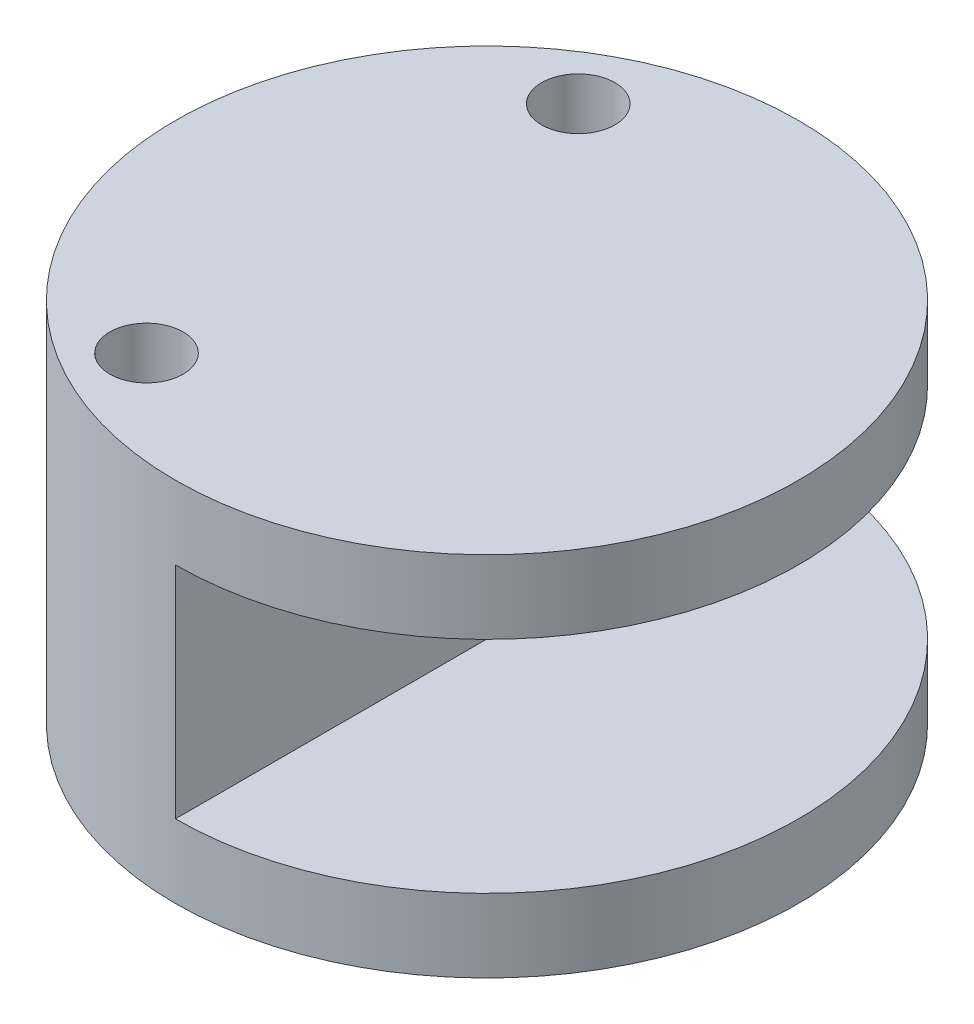
ISO-10303-21;
HEADER;
FILE_DESCRIPTION(('STEP AP214'),'2;1');
FILE_NAME('part.step','',(''),(''),'','','');
FILE_SCHEMA(('AUTOMOTIVE_DESIGN { 1 0 10303 214 1 1 1 1 }'));
ENDSEC;
DATA;
#1=APPLICATION_CONTEXT('core data for automotive mechanical design processes');
#2=APPLICATION_PROTOCOL_DEFINITION('international standard','automotive_design',2000,#1);
#3=PRODUCT_CONTEXT('',#1,'mechanical');
#4=PRODUCT('Part','Part','',(#3));
#5=PRODUCT_RELATED_PRODUCT_CATEGORY('part','',(#4));
#6=PRODUCT_DEFINITION_FORMATION('','',#4);
#7=PRODUCT_DEFINITION_CONTEXT('part definition',#1,'design');
#8=PRODUCT_DEFINITION('design','',#6,#7);
#9=PRODUCT_DEFINITION_SHAPE('','',#8);
#10=(LENGTH_UNIT() NAMED_UNIT(*) SI_UNIT(.MILLI.,.METRE.));
#11=(NAMED_UNIT(*) PLANE_ANGLE_UNIT() SI_UNIT($,.RADIAN.));
#12=(NAMED_UNIT(*) SI_UNIT($,.STERADIAN.) SOLID_ANGLE_UNIT());
#13=UNCERTAINTY_MEASURE_WITH_UNIT(LENGTH_MEASURE(1.E-05),#10,'distance_accuracy_value','');
#14=(GEOMETRIC_REPRESENTATION_CONTEXT(3) GLOBAL_UNCERTAINTY_ASSIGNED_CONTEXT((#13)) GLOBAL_UNIT_ASSIGNED_CONTEXT((#10,
#11,#12)) REPRESENTATION_CONTEXT('',''));
#15=CARTESIAN_POINT('',(0.,0.,0.));
#16=DIRECTION('',(0.,0.,1.));
#17=DIRECTION('',(1.,0.,0.));
#18=AXIS2_PLACEMENT_3D('',#15,#16,#17);
#19=CARTESIAN_POINT('',(0.,-12.7,0.));
#20=DIRECTION('',(0.,1.,0.));
#21=DIRECTION('',(0.,0.,1.));
#22=AXIS2_PLACEMENT_3D('',#19,#20,#21);
#23=CYLINDRICAL_SURFACE('',#22,10.795);
#24=DIRECTION('',(0.,1.,0.));
#25=VECTOR('',#24,1.);
#26=CARTESIAN_POINT('',(0.,-12.7,10.795));
#27=LINE('',#26,#25);
#28=CARTESIAN_POINT('',(0.,-2.54,10.795));
#29=VERTEX_POINT('',#28);
#30=CARTESIAN_POINT('',(0.,-10.16,10.795));
#31=VERTEX_POINT('',#30);
#32=EDGE_CURVE('E11',#29,#31,#27,.F.);
#33=ORIENTED_EDGE('',*,*,#32,.F.);
#34=CARTESIAN_POINT('',(0.,-2.54,0.));
#35=DIRECTION('',(0.,1.,0.));
#36=DIRECTION('',(0.,0.,1.));
#37=AXIS2_PLACEMENT_3D('',#34,#35,#36);
#38=CIRCLE('',#37,10.795);
#39=CARTESIAN_POINT('',(0.,-2.54,-10.795));
#40=VERTEX_POINT('',#39);
#41=EDGE_CURVE('E41',#40,#29,#38,.F.);
#42=ORIENTED_EDGE('',*,*,#41,.F.);
#43=DIRECTION('',(0.,1.,0.));
#44=VECTOR('',#43,1.);
#45=CARTESIAN_POINT('',(0.,-12.7,-10.795));
#46=LINE('',#45,#44);
#47=CARTESIAN_POINT('',(0.,-10.16,-10.795));
#48=VERTEX_POINT('',#47);
#49=EDGE_CURVE('E66',#48,#40,#46,.T.);
#50=ORIENTED_EDGE('',*,*,#49,.F.);
#51=CARTESIAN_POINT('',(0.,-10.16,0.));
#52=DIRECTION('',(0.,1.,0.));
#53=DIRECTION('',(0.,0.,1.));
#54=AXIS2_PLACEMENT_3D('',#51,#52,#53);
#55=CIRCLE('',#54,10.795);
#56=EDGE_CURVE('E54',#48,#31,#55,.F.);
#57=ORIENTED_EDGE('',*,*,#56,.T.);
#58=EDGE_LOOP('',(#33,#42,#50,#57));
#59=FACE_BOUND('',#58,.T.);
#60=CARTESIAN_POINT('',(0.,-12.7,0.));
#61=DIRECTION('',(0.,1.,0.));
#62=DIRECTION('',(0.,0.,1.));
#63=AXIS2_PLACEMENT_3D('',#60,#61,#62);
#64=CIRCLE('',#63,10.795);
#65=CARTESIAN_POINT('',(0.,-12.7,10.795));
#66=VERTEX_POINT('',#65);
#67=EDGE_CURVE('E75',#66,#66,#64,.T.);
#68=ORIENTED_EDGE('',*,*,#67,.T.);
#69=EDGE_LOOP('',(#68));
#70=FACE_BOUND('',#69,.T.);
#71=CARTESIAN_POINT('',(0.,0.,0.));
#72=DIRECTION('',(0.,1.,0.));
#73=DIRECTION('',(0.,0.,1.));
#74=AXIS2_PLACEMENT_3D('',#71,#72,#73);
#75=CIRCLE('',#74,10.795);
#76=CARTESIAN_POINT('',(0.,0.,10.795));
#77=VERTEX_POINT('',#76);
#78=EDGE_CURVE('E78',#77,#77,#75,.T.);
#79=ORIENTED_EDGE('',*,*,#78,.F.);
#80=EDGE_LOOP('',(#79));
#81=FACE_BOUND('',#80,.T.);
#82=ADVANCED_FACE('F34',(#59,#70,#81),#23,.T.);
#83=CARTESIAN_POINT('',(0.,-12.7,0.));
#84=DIRECTION('',(0.,1.,0.));
#85=DIRECTION('',(0.,0.,1.));
#86=AXIS2_PLACEMENT_3D('',#83,#84,#85);
#87=PLANE('',#86);
#88=ORIENTED_EDGE('',*,*,#67,.F.);
#89=EDGE_LOOP('',(#88));
#90=FACE_BOUND('',#89,.T.);
#91=ADVANCED_FACE('F71',(#90),#87,.F.);
#92=CARTESIAN_POINT('',(0.,0.,0.));
#93=DIRECTION('',(0.,1.,0.));
#94=DIRECTION('',(0.,0.,1.));
#95=AXIS2_PLACEMENT_3D('',#92,#93,#94);
#96=PLANE('',#95);
#97=CARTESIAN_POINT('',(-4.31799999999993,0.,-7.47899538708245));
#98=DIRECTION('',(0.,1.,0.));
#99=DIRECTION('',(0.,0.,1.));
#100=AXIS2_PLACEMENT_3D('',#97,#98,#99);
#101=CIRCLE('',#100,1.27);
#102=CARTESIAN_POINT('',(-4.31799999999993,0.,-6.20899538708245));
#103=VERTEX_POINT('',#102);
#104=EDGE_CURVE('E89',#103,#103,#101,.T.);
#105=ORIENTED_EDGE('',*,*,#104,.F.);
#106=EDGE_LOOP('',(#105));
#107=FACE_BOUND('',#106,.T.);
#108=CARTESIAN_POINT('',(-4.31800000000004,0.,7.47899538708239));
#109=DIRECTION('',(0.,1.,0.));
#110=DIRECTION('',(0.,0.,1.));
#111=AXIS2_PLACEMENT_3D('',#108,#109,#110);
#112=CIRCLE('',#111,1.27);
#113=CARTESIAN_POINT('',(-4.31800000000004,0.,8.7489953870824));
#114=VERTEX_POINT('',#113);
#115=EDGE_CURVE('E86',#114,#114,#112,.T.);
#116=ORIENTED_EDGE('',*,*,#115,.F.);
#117=EDGE_LOOP('',(#116));
#118=FACE_BOUND('',#117,.T.);
#119=ORIENTED_EDGE('',*,*,#78,.T.);
#120=EDGE_LOOP('',(#119));
#121=FACE_BOUND('',#120,.T.);
#122=ADVANCED_FACE('F100',(#107,#118,#121),#96,.T.);
#123=CARTESIAN_POINT('',(10.795,-2.54,13.6480910790271));
#124=DIRECTION('',(0.,1.,0.));
#125=DIRECTION('',(0.,0.,1.));
#126=AXIS2_PLACEMENT_3D('',#123,#124,#125);
#127=PLANE('',#126);
#128=ORIENTED_EDGE('',*,*,#41,.T.);
#129=DIRECTION('',(0.,0.,-1.));
#130=VECTOR('',#129,1.);
#131=CARTESIAN_POINT('',(0.,-2.54,13.6480910790271));
#132=LINE('',#131,#130);
#133=EDGE_CURVE('E64',#29,#40,#132,.T.);
#134=ORIENTED_EDGE('',*,*,#133,.T.);
#135=EDGE_LOOP('',(#128,#134));
#136=FACE_BOUND('',#135,.T.);
#137=ADVANCED_FACE('F63',(#136),#127,.F.);
#138=CARTESIAN_POINT('',(10.795,-10.16,13.6480910790271));
#139=DIRECTION('',(0.,1.,0.));
#140=DIRECTION('',(0.,0.,1.));
#141=AXIS2_PLACEMENT_3D('',#138,#139,#140);
#142=PLANE('',#141);
#143=DIRECTION('',(0.,0.,-1.));
#144=VECTOR('',#143,1.);
#145=CARTESIAN_POINT('',(0.,-10.16,13.6480910790271));
#146=LINE('',#145,#144);
#147=EDGE_CURVE('E47',#31,#48,#146,.T.);
#148=ORIENTED_EDGE('',*,*,#147,.F.);
#149=ORIENTED_EDGE('',*,*,#56,.F.);
#150=EDGE_LOOP('',(#148,#149));
#151=FACE_BOUND('',#150,.T.);
#152=ADVANCED_FACE('F116',(#151),#142,.T.);
#153=CARTESIAN_POINT('',(0.,0.,0.));
#154=DIRECTION('',(-1.,0.,0.));
#155=DIRECTION('',(0.,0.,1.));
#156=AXIS2_PLACEMENT_3D('',#153,#154,#155);
#157=PLANE('',#156);
#158=ORIENTED_EDGE('',*,*,#32,.T.);
#159=ORIENTED_EDGE('',*,*,#147,.T.);
#160=ORIENTED_EDGE('',*,*,#49,.T.);
#161=ORIENTED_EDGE('',*,*,#133,.F.);
#162=EDGE_LOOP('',(#158,#159,#160,#161));
#163=FACE_BOUND('',#162,.T.);
#164=ADVANCED_FACE('F65',(#163),#157,.F.);
#165=CARTESIAN_POINT('',(-4.31800000000004,-7.62,7.47899538708239));
#166=DIRECTION('',(0.,1.,0.));
#167=DIRECTION('',(0.,0.,1.));
#168=AXIS2_PLACEMENT_3D('',#165,#166,#167);
#169=CYLINDRICAL_SURFACE('',#168,1.27);
#170=CARTESIAN_POINT('',(-4.31800000000004,-7.62,7.47899538708239));
#171=DIRECTION('',(0.,1.,0.));
#172=DIRECTION('',(0.,0.,1.));
#173=AXIS2_PLACEMENT_3D('',#170,#171,#172);
#174=CIRCLE('',#173,1.27);
#175=CARTESIAN_POINT('',(-4.31800000000004,-7.62,8.7489953870824));
#176=VERTEX_POINT('',#175);
#177=EDGE_CURVE('E67',#176,#176,#174,.T.);
#178=CARTESIAN_POINT('',(-4.31800000000004,-7.62,8.7489953870824));
#179=CARTESIAN_POINT('',(-4.31800000000004,-7.540625,8.7489953870824));
#180=CARTESIAN_POINT('',(-4.31800000000004,-7.46125,8.7489953870824));
#181=CARTESIAN_POINT('',(-4.31800000000004,-7.3025,8.7489953870824));
#182=CARTESIAN_POINT('',(-4.31800000000004,-7.223125,8.7489953870824));
#183=CARTESIAN_POINT('',(-4.31800000000004,-7.064375,8.7489953870824));
#184=CARTESIAN_POINT('',(-4.31800000000004,-6.985,8.7489953870824));
#185=CARTESIAN_POINT('',(-4.31800000000004,-6.82625,8.7489953870824));
#186=CARTESIAN_POINT('',(-4.31800000000004,-6.746875,8.7489953870824));
#187=CARTESIAN_POINT('',(-4.31800000000004,-6.588125,8.7489953870824));
#188=CARTESIAN_POINT('',(-4.31800000000004,-6.50875,8.7489953870824));
#189=CARTESIAN_POINT('',(-4.31800000000004,-6.35,8.7489953870824));
#190=CARTESIAN_POINT('',(-4.31800000000004,-6.270625,8.7489953870824));
#191=CARTESIAN_POINT('',(-4.31800000000004,-6.111875,8.7489953870824));
#192=CARTESIAN_POINT('',(-4.31800000000004,-6.0325,8.7489953870824));
#193=CARTESIAN_POINT('',(-4.31800000000004,-5.87375,8.7489953870824));
#194=CARTESIAN_POINT('',(-4.31800000000004,-5.794375,8.7489953870824));
#195=CARTESIAN_POINT('',(-4.31800000000004,-5.635625,8.7489953870824));
#196=CARTESIAN_POINT('',(-4.31800000000004,-5.55625,8.7489953870824));
#197=CARTESIAN_POINT('',(-4.31800000000004,-5.3975,8.7489953870824));
#198=CARTESIAN_POINT('',(-4.31800000000004,-5.318125,8.7489953870824));
#199=CARTESIAN_POINT('',(-4.31800000000004,-5.159375,8.7489953870824));
#200=CARTESIAN_POINT('',(-4.31800000000004,-5.08,8.7489953870824));
#201=CARTESIAN_POINT('',(-4.31800000000004,-4.92125,8.7489953870824));
#202=CARTESIAN_POINT('',(-4.31800000000004,-4.841875,8.7489953870824));
#203=CARTESIAN_POINT('',(-4.31800000000004,-4.683125,8.7489953870824));
#204=CARTESIAN_POINT('',(-4.31800000000004,-4.60375,8.7489953870824));
#205=CARTESIAN_POINT('',(-4.31800000000004,-4.445,8.7489953870824));
#206=CARTESIAN_POINT('',(-4.31800000000004,-4.365625,8.7489953870824));
#207=CARTESIAN_POINT('',(-4.31800000000004,-4.206875,8.7489953870824));
#208=CARTESIAN_POINT('',(-4.31800000000004,-4.1275,8.7489953870824));
#209=CARTESIAN_POINT('',(-4.31800000000004,-3.96875,8.7489953870824));
#210=CARTESIAN_POINT('',(-4.31800000000004,-3.889375,8.7489953870824));
#211=CARTESIAN_POINT('',(-4.31800000000004,-3.730625,8.7489953870824));
#212=CARTESIAN_POINT('',(-4.31800000000004,-3.65125,8.7489953870824));
#213=CARTESIAN_POINT('',(-4.31800000000004,-3.4925,8.7489953870824));
#214=CARTESIAN_POINT('',(-4.31800000000004,-3.413125,8.7489953870824));
#215=CARTESIAN_POINT('',(-4.31800000000004,-3.254375,8.7489953870824));
#216=CARTESIAN_POINT('',(-4.31800000000004,-3.175,8.7489953870824));
#217=CARTESIAN_POINT('',(-4.31800000000004,-3.01625,8.7489953870824));
#218=CARTESIAN_POINT('',(-4.31800000000004,-2.936875,8.7489953870824));
#219=CARTESIAN_POINT('',(-4.31800000000004,-2.778125,8.7489953870824));
#220=CARTESIAN_POINT('',(-4.31800000000004,-2.69875,8.7489953870824));
#221=CARTESIAN_POINT('',(-4.31800000000004,-2.54,8.7489953870824));
#222=CARTESIAN_POINT('',(-4.31800000000004,-2.460625,8.7489953870824));
#223=CARTESIAN_POINT('',(-4.31800000000004,-2.301875,8.7489953870824));
#224=CARTESIAN_POINT('',(-4.31800000000004,-2.2225,8.7489953870824));
#225=CARTESIAN_POINT('',(-4.31800000000004,-2.06375,8.7489953870824));
#226=CARTESIAN_POINT('',(-4.31800000000004,-1.984375,8.7489953870824));
#227=CARTESIAN_POINT('',(-4.31800000000004,-1.825625,8.7489953870824));
#228=CARTESIAN_POINT('',(-4.31800000000004,-1.74625,8.7489953870824));
#229=CARTESIAN_POINT('',(-4.31800000000004,-1.5875,8.7489953870824));
#230=CARTESIAN_POINT('',(-4.31800000000004,-1.508125,8.7489953870824));
#231=CARTESIAN_POINT('',(-4.31800000000004,-1.349375,8.7489953870824));
#232=CARTESIAN_POINT('',(-4.31800000000004,-1.27,8.7489953870824));
#233=CARTESIAN_POINT('',(-4.31800000000004,-1.11125,8.7489953870824));
#234=CARTESIAN_POINT('',(-4.31800000000004,-1.031875,8.7489953870824));
#235=CARTESIAN_POINT('',(-4.31800000000004,-0.873125,8.7489953870824));
#236=CARTESIAN_POINT('',(-4.31800000000004,-0.79375,8.7489953870824));
#237=CARTESIAN_POINT('',(-4.31800000000004,-0.635,8.7489953870824));
#238=CARTESIAN_POINT('',(-4.31800000000004,-0.555625,8.7489953870824));
#239=CARTESIAN_POINT('',(-4.31800000000004,-0.396875,8.7489953870824));
#240=CARTESIAN_POINT('',(-4.31800000000004,-0.3175,8.7489953870824));
#241=CARTESIAN_POINT('',(-4.31800000000004,-0.15875,8.7489953870824));
#242=CARTESIAN_POINT('',(-4.31800000000004,-0.0793749999999999,8.7489953870824));
#243=CARTESIAN_POINT('',(-4.31800000000004,0.,8.7489953870824));
#244=B_SPLINE_CURVE_WITH_KNOTS('',3,(#178,#179,#180,#181,#182,#183,#184,#185,#186,#187,#188,
#189,#190,#191,#192,#193,#194,#195,#196,#197,#198,#199,#200,#201,#202,#203,#204,#205,#206,#207,
#208,#209,#210,#211,#212,#213,#214,#215,#216,#217,#218,#219,#220,#221,#222,#223,#224,#225,#226,
#227,#228,#229,#230,#231,#232,#233,#234,#235,#236,#237,#238,#239,#240,#241,#242,#243),
.UNSPECIFIED.,.F.,.F.,(4,2,2,2,2,2,2,2,2,2,2,2,2,2,2,2,2,2,2,2,2,2,2,2,2,2,2,2,2,2,2,2,4),(0.,
0.238125,0.47625,0.714375000000001,0.9525,1.190625,1.42875,1.666875,1.905,2.143125,2.38125,
2.619375,2.8575,3.095625,3.33375,3.571875,3.81,4.048125,4.28625,4.524375,4.7625,5.000625,
5.23875,5.476875,5.715,5.953125,6.19125,6.429375,6.6675,6.905625,7.14375,7.381875,7.62),.UNSPECIFIED.);
#245=EDGE_CURVE('BSEAM105',#176,#114,#244,.T.);
#246=ORIENTED_EDGE('',*,*,#177,.F.);
#247=ORIENTED_EDGE('',*,*,#115,.T.);
#248=ORIENTED_EDGE('',*,*,#245,.T.);
#249=ORIENTED_EDGE('',*,*,#245,.F.);
#250=EDGE_LOOP('',(#246,#248,#247,#249));
#251=FACE_BOUND('',#250,.T.);
#252=ADVANCED_FACE('F105',(#251),#169,.F.);
#253=CARTESIAN_POINT('',(-4.31800000000004,-7.62,7.47899538708239));
#254=DIRECTION('',(0.,1.,0.));
#255=DIRECTION('',(0.,0.,1.));
#256=AXIS2_PLACEMENT_3D('',#253,#254,#255);
#257=PLANE('',#256);
#258=ORIENTED_EDGE('',*,*,#177,.T.);
#259=EDGE_LOOP('',(#258));
#260=FACE_BOUND('',#259,.T.);
#261=ADVANCED_FACE('F107',(#260),#257,.T.);
#262=CARTESIAN_POINT('',(-4.31799999999993,-7.62,-7.47899538708245));
#263=DIRECTION('',(0.,1.,0.));
#264=DIRECTION('',(0.,0.,1.));
#265=AXIS2_PLACEMENT_3D('',#262,#263,#264);
#266=CYLINDRICAL_SURFACE('',#265,1.27);
#267=CARTESIAN_POINT('',(-4.31799999999993,-7.62,-7.47899538708245));
#268=DIRECTION('',(0.,1.,0.));
#269=DIRECTION('',(0.,0.,1.));
#270=AXIS2_PLACEMENT_3D('',#267,#268,#269);
#271=CIRCLE('',#270,1.27);
#272=CARTESIAN_POINT('',(-4.31799999999993,-7.62,-6.20899538708245));
#273=VERTEX_POINT('',#272);
#274=EDGE_CURVE('E92',#273,#273,#271,.T.);
#275=CARTESIAN_POINT('',(-4.31799999999993,-7.62,-6.20899538708245));
#276=CARTESIAN_POINT('',(-4.31799999999993,-7.540625,-6.20899538708245));
#277=CARTESIAN_POINT('',(-4.31799999999993,-7.46125,-6.20899538708245));
#278=CARTESIAN_POINT('',(-4.31799999999993,-7.3025,-6.20899538708245));
#279=CARTESIAN_POINT('',(-4.31799999999993,-7.223125,-6.20899538708245));
#280=CARTESIAN_POINT('',(-4.31799999999993,-7.064375,-6.20899538708245));
#281=CARTESIAN_POINT('',(-4.31799999999993,-6.985,-6.20899538708245));
#282=CARTESIAN_POINT('',(-4.31799999999993,-6.82625,-6.20899538708245));
#283=CARTESIAN_POINT('',(-4.31799999999993,-6.746875,-6.20899538708245));
#284=CARTESIAN_POINT('',(-4.31799999999993,-6.588125,-6.20899538708245));
#285=CARTESIAN_POINT('',(-4.31799999999993,-6.50875,-6.20899538708245));
#286=CARTESIAN_POINT('',(-4.31799999999993,-6.35,-6.20899538708245));
#287=CARTESIAN_POINT('',(-4.31799999999993,-6.270625,-6.20899538708245));
#288=CARTESIAN_POINT('',(-4.31799999999993,-6.111875,-6.20899538708245));
#289=CARTESIAN_POINT('',(-4.31799999999993,-6.0325,-6.20899538708245));
#290=CARTESIAN_POINT('',(-4.31799999999993,-5.87375,-6.20899538708245));
#291=CARTESIAN_POINT('',(-4.31799999999993,-5.794375,-6.20899538708245));
#292=CARTESIAN_POINT('',(-4.31799999999993,-5.635625,-6.20899538708245));
#293=CARTESIAN_POINT('',(-4.31799999999993,-5.55625,-6.20899538708245));
#294=CARTESIAN_POINT('',(-4.31799999999993,-5.3975,-6.20899538708245));
#295=CARTESIAN_POINT('',(-4.31799999999993,-5.318125,-6.20899538708245));
#296=CARTESIAN_POINT('',(-4.31799999999993,-5.159375,-6.20899538708245));
#297=CARTESIAN_POINT('',(-4.31799999999993,-5.08,-6.20899538708245));
#298=CARTESIAN_POINT('',(-4.31799999999993,-4.92125,-6.20899538708245));
#299=CARTESIAN_POINT('',(-4.31799999999993,-4.841875,-6.20899538708245));
#300=CARTESIAN_POINT('',(-4.31799999999993,-4.683125,-6.20899538708245));
#301=CARTESIAN_POINT('',(-4.31799999999993,-4.60375,-6.20899538708245));
#302=CARTESIAN_POINT('',(-4.31799999999993,-4.445,-6.20899538708245));
#303=CARTESIAN_POINT('',(-4.31799999999993,-4.365625,-6.20899538708245));
#304=CARTESIAN_POINT('',(-4.31799999999993,-4.206875,-6.20899538708245));
#305=CARTESIAN_POINT('',(-4.31799999999993,-4.1275,-6.20899538708245));
#306=CARTESIAN_POINT('',(-4.31799999999993,-3.96875,-6.20899538708245));
#307=CARTESIAN_POINT('',(-4.31799999999993,-3.889375,-6.20899538708245));
#308=CARTESIAN_POINT('',(-4.31799999999993,-3.730625,-6.20899538708245));
#309=CARTESIAN_POINT('',(-4.31799999999993,-3.65125,-6.20899538708245));
#310=CARTESIAN_POINT('',(-4.31799999999993,-3.4925,-6.20899538708245));
#311=CARTESIAN_POINT('',(-4.31799999999993,-3.413125,-6.20899538708245));
#312=CARTESIAN_POINT('',(-4.31799999999993,-3.254375,-6.20899538708245));
#313=CARTESIAN_POINT('',(-4.31799999999993,-3.175,-6.20899538708245));
#314=CARTESIAN_POINT('',(-4.31799999999993,-3.01625,-6.20899538708245));
#315=CARTESIAN_POINT('',(-4.31799999999993,-2.936875,-6.20899538708245));
#316=CARTESIAN_POINT('',(-4.31799999999993,-2.778125,-6.20899538708245));
#317=CARTESIAN_POINT('',(-4.31799999999993,-2.69875,-6.20899538708245));
#318=CARTESIAN_POINT('',(-4.31799999999993,-2.54,-6.20899538708245));
#319=CARTESIAN_POINT('',(-4.31799999999993,-2.460625,-6.20899538708245));
#320=CARTESIAN_POINT('',(-4.31799999999993,-2.301875,-6.20899538708245));
#321=CARTESIAN_POINT('',(-4.31799999999993,-2.2225,-6.20899538708245));
#322=CARTESIAN_POINT('',(-4.31799999999993,-2.06375,-6.20899538708245));
#323=CARTESIAN_POINT('',(-4.31799999999993,-1.984375,-6.20899538708245));
#324=CARTESIAN_POINT('',(-4.31799999999993,-1.825625,-6.20899538708245));
#325=CARTESIAN_POINT('',(-4.31799999999993,-1.74625,-6.20899538708245));
#326=CARTESIAN_POINT('',(-4.31799999999993,-1.5875,-6.20899538708245));
#327=CARTESIAN_POINT('',(-4.31799999999993,-1.508125,-6.20899538708245));
#328=CARTESIAN_POINT('',(-4.31799999999993,-1.349375,-6.20899538708245));
#329=CARTESIAN_POINT('',(-4.31799999999993,-1.27,-6.20899538708245));
#330=CARTESIAN_POINT('',(-4.31799999999993,-1.11125,-6.20899538708245));
#331=CARTESIAN_POINT('',(-4.31799999999993,-1.031875,-6.20899538708245));
#332=CARTESIAN_POINT('',(-4.31799999999993,-0.873125,-6.20899538708245));
#333=CARTESIAN_POINT('',(-4.31799999999993,-0.79375,-6.20899538708245));
#334=CARTESIAN_POINT('',(-4.31799999999993,-0.635,-6.20899538708245));
#335=CARTESIAN_POINT('',(-4.31799999999993,-0.555625,-6.20899538708245));
#336=CARTESIAN_POINT('',(-4.31799999999993,-0.396875,-6.20899538708245));
#337=CARTESIAN_POINT('',(-4.31799999999993,-0.3175,-6.20899538708245));
#338=CARTESIAN_POINT('',(-4.31799999999993,-0.15875,-6.20899538708245));
#339=CARTESIAN_POINT('',(-4.31799999999993,-0.0793749999999999,-6.20899538708245));
#340=CARTESIAN_POINT('',(-4.31799999999993,0.,-6.20899538708245));
#341=B_SPLINE_CURVE_WITH_KNOTS('',3,(#275,#276,#277,#278,#279,#280,#281,#282,#283,#284,#285,
#286,#287,#288,#289,#290,#291,#292,#293,#294,#295,#296,#297,#298,#299,#300,#301,#302,#303,#304,
#305,#306,#307,#308,#309,#310,#311,#312,#313,#314,#315,#316,#317,#318,#319,#320,#321,#322,#323,
#324,#325,#326,#327,#328,#329,#330,#331,#332,#333,#334,#335,#336,#337,#338,#339,#340),
.UNSPECIFIED.,.F.,.F.,(4,2,2,2,2,2,2,2,2,2,2,2,2,2,2,2,2,2,2,2,2,2,2,2,2,2,2,2,2,2,2,2,4),(0.,
0.238125,0.47625,0.714375000000001,0.9525,1.190625,1.42875,1.666875,1.905,2.143125,2.38125,
2.619375,2.8575,3.095625,3.33375,3.571875,3.81,4.048125,4.28625,4.524375,4.7625,5.000625,
5.23875,5.476875,5.715,5.953125,6.19125,6.429375,6.6675,6.905625,7.14375,7.381875,7.62),.UNSPECIFIED.);
#342=EDGE_CURVE('BSEAM98',#273,#103,#341,.T.);
#343=ORIENTED_EDGE('',*,*,#274,.F.);
#344=ORIENTED_EDGE('',*,*,#104,.T.);
#345=ORIENTED_EDGE('',*,*,#342,.T.);
#346=ORIENTED_EDGE('',*,*,#342,.F.);
#347=EDGE_LOOP('',(#343,#345,#344,#346));
#348=FACE_BOUND('',#347,.T.);
#349=ADVANCED_FACE('F98',(#348),#266,.F.);
#350=CARTESIAN_POINT('',(-4.31799999999993,-7.62,-7.47899538708245));
#351=DIRECTION('',(0.,1.,0.));
#352=DIRECTION('',(0.,0.,1.));
#353=AXIS2_PLACEMENT_3D('',#350,#351,#352);
#354=PLANE('',#353);
#355=ORIENTED_EDGE('',*,*,#274,.T.);
#356=EDGE_LOOP('',(#355));
#357=FACE_BOUND('',#356,.T.);
#358=ADVANCED_FACE('F169',(#357),#354,.T.);
#359=CLOSED_SHELL('',(#82,#91,#122,#137,#152,#164,#252,#261,#349,#358));
#360=MANIFOLD_SOLID_BREP('B2',#359);
#361=ADVANCED_BREP_SHAPE_REPRESENTATION('',(#18,#360),#14);
#362=SHAPE_DEFINITION_REPRESENTATION(#9,#361);
ENDSEC;
END-ISO-10303-21;
